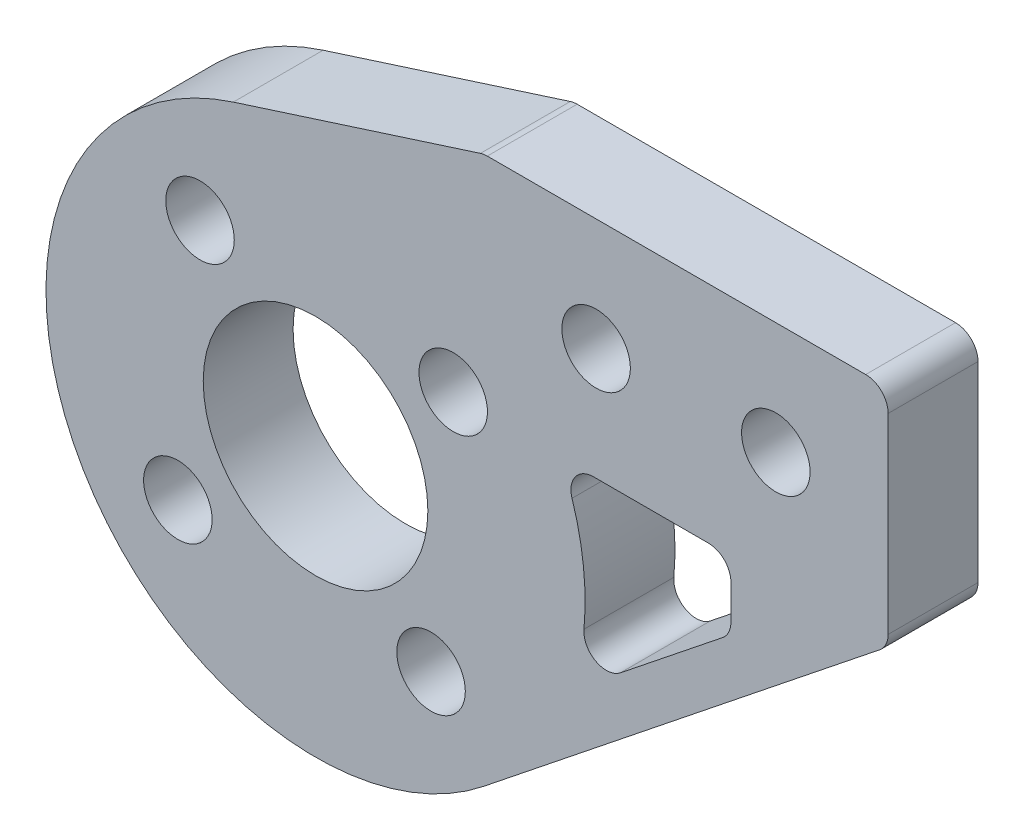
ISO-10303-21;
HEADER;
FILE_DESCRIPTION(('STEP AP214'),'2;1');
FILE_NAME('part.step','',(''),(''),'','','');
FILE_SCHEMA(('AUTOMOTIVE_DESIGN { 1 0 10303 214 1 1 1 1 }'));
ENDSEC;
DATA;
#1=APPLICATION_CONTEXT('core data for automotive mechanical design processes');
#2=APPLICATION_PROTOCOL_DEFINITION('international standard','automotive_design',2000,#1);
#3=PRODUCT_CONTEXT('',#1,'mechanical');
#4=PRODUCT('Part','Part','',(#3));
#5=PRODUCT_RELATED_PRODUCT_CATEGORY('part','',(#4));
#6=PRODUCT_DEFINITION_FORMATION('','',#4);
#7=PRODUCT_DEFINITION_CONTEXT('part definition',#1,'design');
#8=PRODUCT_DEFINITION('design','',#6,#7);
#9=PRODUCT_DEFINITION_SHAPE('','',#8);
#10=(LENGTH_UNIT() NAMED_UNIT(*) SI_UNIT(.MILLI.,.METRE.));
#11=(NAMED_UNIT(*) PLANE_ANGLE_UNIT() SI_UNIT($,.RADIAN.));
#12=(NAMED_UNIT(*) SI_UNIT($,.STERADIAN.) SOLID_ANGLE_UNIT());
#13=UNCERTAINTY_MEASURE_WITH_UNIT(LENGTH_MEASURE(1.E-05),#10,'distance_accuracy_value','');
#14=(GEOMETRIC_REPRESENTATION_CONTEXT(3) GLOBAL_UNCERTAINTY_ASSIGNED_CONTEXT((#13)) GLOBAL_UNIT_ASSIGNED_CONTEXT((#10,
#11,#12)) REPRESENTATION_CONTEXT('',''));
#15=CARTESIAN_POINT('',(0.,0.,0.));
#16=DIRECTION('',(0.,0.,1.));
#17=DIRECTION('',(1.,0.,0.));
#18=AXIS2_PLACEMENT_3D('',#15,#16,#17);
#19=CARTESIAN_POINT('',(0.,0.,4.));
#20=DIRECTION('',(0.,0.,1.));
#21=DIRECTION('',(1.,0.,0.));
#22=AXIS2_PLACEMENT_3D('',#19,#20,#21);
#23=PLANE('',#22);
#24=CARTESIAN_POINT('',(-6.12835554495183,-5.14230087749231,4.));
#25=DIRECTION('',(0.,0.,1.));
#26=DIRECTION('',(1.,0.,0.));
#27=AXIS2_PLACEMENT_3D('',#24,#25,#26);
#28=CIRCLE('',#27,1.525);
#29=CARTESIAN_POINT('',(-4.60335554495183,-5.14230087749231,4.));
#30=VERTEX_POINT('',#29);
#31=EDGE_CURVE('E284',#30,#30,#28,.T.);
#32=ORIENTED_EDGE('',*,*,#31,.F.);
#33=EDGE_LOOP('',(#32));
#34=FACE_BOUND('',#33,.T.);
#35=CARTESIAN_POINT('',(5.1423008774923,-6.12835554495183,4.));
#36=DIRECTION('',(0.,0.,1.));
#37=DIRECTION('',(1.,0.,0.));
#38=AXIS2_PLACEMENT_3D('',#35,#36,#37);
#39=CIRCLE('',#38,1.525);
#40=CARTESIAN_POINT('',(6.66730087749231,-6.12835554495183,4.));
#41=VERTEX_POINT('',#40);
#42=EDGE_CURVE('E287',#41,#41,#39,.T.);
#43=ORIENTED_EDGE('',*,*,#42,.F.);
#44=EDGE_LOOP('',(#43));
#45=FACE_BOUND('',#44,.T.);
#46=CARTESIAN_POINT('',(6.12835554495183,5.1423008774923,4.));
#47=DIRECTION('',(0.,0.,1.));
#48=DIRECTION('',(1.,0.,0.));
#49=AXIS2_PLACEMENT_3D('',#46,#47,#48);
#50=CIRCLE('',#49,1.525);
#51=CARTESIAN_POINT('',(7.65335554495184,5.1423008774923,4.));
#52=VERTEX_POINT('',#51);
#53=EDGE_CURVE('E291',#52,#52,#50,.T.);
#54=ORIENTED_EDGE('',*,*,#53,.F.);
#55=EDGE_LOOP('',(#54));
#56=FACE_BOUND('',#55,.T.);
#57=CARTESIAN_POINT('',(0.,0.,4.));
#58=DIRECTION('',(0.,0.,1.));
#59=DIRECTION('',(1.,0.,0.));
#60=AXIS2_PLACEMENT_3D('',#57,#58,#59);
#61=CIRCLE('',#60,5.);
#62=CARTESIAN_POINT('',(5.,0.,4.));
#63=VERTEX_POINT('',#62);
#64=EDGE_CURVE('E294',#63,#63,#61,.T.);
#65=ORIENTED_EDGE('',*,*,#64,.F.);
#66=EDGE_LOOP('',(#65));
#67=FACE_BOUND('',#66,.T.);
#68=CARTESIAN_POINT('',(-5.1423008774923,6.12835554495183,4.));
#69=DIRECTION('',(0.,0.,1.));
#70=DIRECTION('',(1.,0.,0.));
#71=AXIS2_PLACEMENT_3D('',#68,#69,#70);
#72=CIRCLE('',#71,1.525);
#73=CARTESIAN_POINT('',(-3.6173008774923,6.12835554495183,4.));
#74=VERTEX_POINT('',#73);
#75=EDGE_CURVE('E172',#74,#74,#72,.T.);
#76=ORIENTED_EDGE('',*,*,#75,.F.);
#77=EDGE_LOOP('',(#76));
#78=FACE_BOUND('',#77,.T.);
#79=DIRECTION('',(-0.781387389104163,-0.624046270839735,0.));
#80=VECTOR('',#79,1.);
#81=CARTESIAN_POINT('',(7.48855525007682,-9.37664866924995,4.));
#82=LINE('',#81,#80);
#83=CARTESIAN_POINT('',(25.1140422676365,4.6997487725522,4.));
#84=VERTEX_POINT('',#83);
#85=CARTESIAN_POINT('',(7.48855525007682,-9.37664866924995,4.));
#86=VERTEX_POINT('',#85);
#87=EDGE_CURVE('E153',#84,#86,#82,.T.);
#88=ORIENTED_EDGE('',*,*,#87,.F.);
#89=CARTESIAN_POINT('',(24.4899959967968,5.48113616165636,4.));
#90=DIRECTION('',(0.,0.,1.));
#91=DIRECTION('',(1.,0.,0.));
#92=AXIS2_PLACEMENT_3D('',#89,#90,#91);
#93=CIRCLE('',#92,1.);
#94=CARTESIAN_POINT('',(25.4899959967968,5.48113616165636,4.));
#95=VERTEX_POINT('',#94);
#96=EDGE_CURVE('E218',#84,#95,#93,.T.);
#97=ORIENTED_EDGE('',*,*,#96,.T.);
#98=DIRECTION('',(0.,-1.,0.));
#99=VECTOR('',#98,1.);
#100=CARTESIAN_POINT('',(25.4899959967968,0.,4.));
#101=LINE('',#100,#99);
#102=CARTESIAN_POINT('',(25.4899959967968,14.,4.));
#103=VERTEX_POINT('',#102);
#104=EDGE_CURVE('E163',#103,#95,#101,.T.);
#105=ORIENTED_EDGE('',*,*,#104,.F.);
#106=CARTESIAN_POINT('',(24.4899959967968,14.,4.));
#107=DIRECTION('',(0.,0.,1.));
#108=DIRECTION('',(1.,0.,0.));
#109=AXIS2_PLACEMENT_3D('',#106,#107,#108);
#110=CIRCLE('',#109,1.);
#111=CARTESIAN_POINT('',(24.4899959967968,15.,4.));
#112=VERTEX_POINT('',#111);
#113=EDGE_CURVE('E216',#103,#112,#110,.T.);
#114=ORIENTED_EDGE('',*,*,#113,.T.);
#115=DIRECTION('',(-1.,0.,0.));
#116=VECTOR('',#115,1.);
#117=CARTESIAN_POINT('',(0.,15.,4.));
#118=LINE('',#117,#116);
#119=CARTESIAN_POINT('',(7.64625439059058,15.,4.));
#120=VERTEX_POINT('',#119);
#121=EDGE_CURVE('E301',#112,#120,#118,.T.);
#122=ORIENTED_EDGE('',*,*,#121,.T.);
#123=CARTESIAN_POINT('',(7.64625439059058,14.,4.));
#124=DIRECTION('',(0.,0.,1.));
#125=DIRECTION('',(1.,0.,0.));
#126=AXIS2_PLACEMENT_3D('',#123,#124,#125);
#127=CIRCLE('',#126,1.);
#128=CARTESIAN_POINT('',(7.34118635336405,14.9523305585052,4.));
#129=VERTEX_POINT('',#128);
#130=EDGE_CURVE('E54',#120,#129,#127,.T.);
#131=ORIENTED_EDGE('',*,*,#130,.T.);
#132=DIRECTION('',(-0.95233055850516,-0.305068037226535,0.));
#133=VECTOR('',#132,1.);
#134=CARTESIAN_POINT('',(-3.66081644671842,11.4279667020619,4.));
#135=LINE('',#134,#133);
#136=CARTESIAN_POINT('',(-3.66081644671842,11.4279667020619,4.));
#137=VERTEX_POINT('',#136);
#138=EDGE_CURVE('E168',#129,#137,#135,.T.);
#139=ORIENTED_EDGE('',*,*,#138,.T.);
#140=CARTESIAN_POINT('',(0.,0.,4.));
#141=DIRECTION('',(0.,0.,1.));
#142=DIRECTION('',(1.,0.,0.));
#143=AXIS2_PLACEMENT_3D('',#140,#141,#142);
#144=CIRCLE('',#143,12.);
#145=EDGE_CURVE('E164',#137,#86,#144,.T.);
#146=ORIENTED_EDGE('',*,*,#145,.T.);
#147=EDGE_LOOP('',(#88,#97,#105,#114,#122,#131,#139,#146));
#148=FACE_BOUND('',#147,.T.);
#149=CARTESIAN_POINT('',(20.4899959967968,10.,4.));
#150=DIRECTION('',(0.,0.,1.));
#151=DIRECTION('',(1.,0.,0.));
#152=AXIS2_PLACEMENT_3D('',#149,#150,#151);
#153=CIRCLE('',#152,1.525);
#154=CARTESIAN_POINT('',(22.0149959967968,10.,4.));
#155=VERTEX_POINT('',#154);
#156=EDGE_CURVE('E304',#155,#155,#153,.T.);
#157=ORIENTED_EDGE('',*,*,#156,.F.);
#158=EDGE_LOOP('',(#157));
#159=FACE_BOUND('',#158,.T.);
#160=CARTESIAN_POINT('',(12.4899959967968,10.,4.));
#161=DIRECTION('',(0.,0.,1.));
#162=DIRECTION('',(1.,0.,0.));
#163=AXIS2_PLACEMENT_3D('',#160,#161,#162);
#164=CIRCLE('',#163,1.525);
#165=CARTESIAN_POINT('',(14.0149959967968,10.,4.));
#166=VERTEX_POINT('',#165);
#167=EDGE_CURVE('E182',#166,#166,#164,.T.);
#168=ORIENTED_EDGE('',*,*,#167,.F.);
#169=EDGE_LOOP('',(#168));
#170=FACE_BOUND('',#169,.T.);
#171=DIRECTION('',(0.781387389104163,0.624046270839735,0.));
#172=VECTOR('',#171,1.);
#173=CARTESIAN_POINT('',(6.24046270839735,-7.81387389104163,4.));
#174=LINE('',#173,#172);
#175=CARTESIAN_POINT('',(13.5705261571603,-1.95980096383015,4.));
#176=VERTEX_POINT('',#175);
#177=CARTESIAN_POINT('',(18.1140422676365,1.66882719779611,4.));
#178=VERTEX_POINT('',#177);
#179=EDGE_CURVE('E254',#176,#178,#174,.T.);
#180=ORIENTED_EDGE('',*,*,#179,.F.);
#181=CARTESIAN_POINT('',(12.9464798863205,-1.17841357472599,4.));
#182=DIRECTION('',(0.,0.,1.));
#183=DIRECTION('',(1.,0.,0.));
#184=AXIS2_PLACEMENT_3D('',#181,#182,#183);
#185=CIRCLE('',#184,1.);
#186=CARTESIAN_POINT('',(11.950596818142,-1.08776637667015,4.));
#187=VERTEX_POINT('',#186);
#188=EDGE_CURVE('E235',#176,#187,#185,.F.);
#189=ORIENTED_EDGE('',*,*,#188,.T.);
#190=CARTESIAN_POINT('',(0.,0.,4.));
#191=DIRECTION('',(0.,0.,1.));
#192=DIRECTION('',(1.,0.,0.));
#193=AXIS2_PLACEMENT_3D('',#190,#191,#192);
#194=CIRCLE('',#193,12.);
#195=CARTESIAN_POINT('',(11.4178309632489,3.69230769230769,4.));
#196=VERTEX_POINT('',#195);
#197=EDGE_CURVE('E277',#187,#196,#194,.T.);
#198=ORIENTED_EDGE('',*,*,#197,.T.);
#199=CARTESIAN_POINT('',(12.369316876853,4.,4.));
#200=DIRECTION('',(0.,0.,1.));
#201=DIRECTION('',(1.,0.,0.));
#202=AXIS2_PLACEMENT_3D('',#199,#200,#201);
#203=CIRCLE('',#202,1.);
#204=CARTESIAN_POINT('',(12.369316876853,5.,4.));
#205=VERTEX_POINT('',#204);
#206=EDGE_CURVE('E227',#196,#205,#203,.F.);
#207=ORIENTED_EDGE('',*,*,#206,.T.);
#208=DIRECTION('',(-1.,0.,0.));
#209=VECTOR('',#208,1.);
#210=CARTESIAN_POINT('',(0.,5.,4.));
#211=LINE('',#210,#209);
#212=CARTESIAN_POINT('',(17.4899959967968,5.,4.));
#213=VERTEX_POINT('',#212);
#214=EDGE_CURVE('E245',#213,#205,#211,.T.);
#215=ORIENTED_EDGE('',*,*,#214,.F.);
#216=CARTESIAN_POINT('',(17.4899959967968,4.,4.));
#217=DIRECTION('',(0.,0.,1.));
#218=DIRECTION('',(1.,0.,0.));
#219=AXIS2_PLACEMENT_3D('',#216,#217,#218);
#220=CIRCLE('',#219,1.);
#221=CARTESIAN_POINT('',(18.4899959967968,4.,4.));
#222=VERTEX_POINT('',#221);
#223=EDGE_CURVE('E47',#213,#222,#220,.F.);
#224=ORIENTED_EDGE('',*,*,#223,.T.);
#225=DIRECTION('',(0.,1.,0.));
#226=VECTOR('',#225,1.);
#227=CARTESIAN_POINT('',(18.4899959967968,0.,4.));
#228=LINE('',#227,#226);
#229=CARTESIAN_POINT('',(18.4899959967968,2.45021458690027,4.));
#230=VERTEX_POINT('',#229);
#231=EDGE_CURVE('E243',#230,#222,#228,.T.);
#232=ORIENTED_EDGE('',*,*,#231,.F.);
#233=CARTESIAN_POINT('',(17.4899959967968,2.45021458690027,4.));
#234=DIRECTION('',(0.,0.,1.));
#235=DIRECTION('',(1.,0.,0.));
#236=AXIS2_PLACEMENT_3D('',#233,#234,#235);
#237=CIRCLE('',#236,1.);
#238=EDGE_CURVE('E231',#230,#178,#237,.F.);
#239=ORIENTED_EDGE('',*,*,#238,.T.);
#240=EDGE_LOOP('',(#180,#189,#198,#207,#215,#224,#232,#239));
#241=FACE_BOUND('',#240,.T.);
#242=ADVANCED_FACE('F39',(#34,#45,#56,#67,#78,#148,#159,#170,#241),#23,.T.);
#243=CARTESIAN_POINT('',(0.,0.,0.));
#244=DIRECTION('',(0.,0.,1.));
#245=DIRECTION('',(1.,0.,0.));
#246=AXIS2_PLACEMENT_3D('',#243,#244,#245);
#247=PLANE('',#246);
#248=CARTESIAN_POINT('',(12.4899959967968,10.,0.));
#249=DIRECTION('',(0.,0.,1.));
#250=DIRECTION('',(1.,0.,0.));
#251=AXIS2_PLACEMENT_3D('',#248,#249,#250);
#252=CIRCLE('',#251,1.525);
#253=CARTESIAN_POINT('',(14.0149959967968,10.,0.));
#254=VERTEX_POINT('',#253);
#255=EDGE_CURVE('E288',#254,#254,#252,.T.);
#256=ORIENTED_EDGE('',*,*,#255,.T.);
#257=EDGE_LOOP('',(#256));
#258=FACE_BOUND('',#257,.T.);
#259=CARTESIAN_POINT('',(20.4899959967968,10.,0.));
#260=DIRECTION('',(0.,0.,1.));
#261=DIRECTION('',(1.,0.,0.));
#262=AXIS2_PLACEMENT_3D('',#259,#260,#261);
#263=CIRCLE('',#262,1.525);
#264=CARTESIAN_POINT('',(22.0149959967968,10.,0.));
#265=VERTEX_POINT('',#264);
#266=EDGE_CURVE('E330',#265,#265,#263,.T.);
#267=ORIENTED_EDGE('',*,*,#266,.T.);
#268=EDGE_LOOP('',(#267));
#269=FACE_BOUND('',#268,.T.);
#270=DIRECTION('',(0.,-1.,0.));
#271=VECTOR('',#270,1.);
#272=CARTESIAN_POINT('',(25.4899959967968,0.,0.));
#273=LINE('',#272,#271);
#274=CARTESIAN_POINT('',(25.4899959967968,14.,0.));
#275=VERTEX_POINT('',#274);
#276=CARTESIAN_POINT('',(25.4899959967968,5.48113616165636,0.));
#277=VERTEX_POINT('',#276);
#278=EDGE_CURVE('E323',#275,#277,#273,.T.);
#279=ORIENTED_EDGE('',*,*,#278,.T.);
#280=CARTESIAN_POINT('',(24.4899959967968,5.48113616165636,0.));
#281=DIRECTION('',(0.,0.,1.));
#282=DIRECTION('',(1.,0.,0.));
#283=AXIS2_PLACEMENT_3D('',#280,#281,#282);
#284=CIRCLE('',#283,1.);
#285=CARTESIAN_POINT('',(25.1140422676365,4.6997487725522,0.));
#286=VERTEX_POINT('',#285);
#287=EDGE_CURVE('E212',#277,#286,#284,.F.);
#288=ORIENTED_EDGE('',*,*,#287,.T.);
#289=DIRECTION('',(-0.781387389104163,-0.624046270839735,0.));
#290=VECTOR('',#289,1.);
#291=CARTESIAN_POINT('',(7.48855525007682,-9.37664866924995,0.));
#292=LINE('',#291,#290);
#293=CARTESIAN_POINT('',(7.48855525007682,-9.37664866924995,0.));
#294=VERTEX_POINT('',#293);
#295=EDGE_CURVE('E321',#286,#294,#292,.T.);
#296=ORIENTED_EDGE('',*,*,#295,.T.);
#297=CARTESIAN_POINT('',(0.,0.,0.));
#298=DIRECTION('',(0.,0.,1.));
#299=DIRECTION('',(1.,0.,0.));
#300=AXIS2_PLACEMENT_3D('',#297,#298,#299);
#301=CIRCLE('',#300,12.);
#302=CARTESIAN_POINT('',(-3.66081644671842,11.4279667020619,0.));
#303=VERTEX_POINT('',#302);
#304=EDGE_CURVE('E176',#303,#294,#301,.T.);
#305=ORIENTED_EDGE('',*,*,#304,.F.);
#306=DIRECTION('',(-0.95233055850516,-0.305068037226535,0.));
#307=VECTOR('',#306,1.);
#308=CARTESIAN_POINT('',(-3.66081644671842,11.4279667020619,0.));
#309=LINE('',#308,#307);
#310=CARTESIAN_POINT('',(7.34118635336405,14.9523305585052,0.));
#311=VERTEX_POINT('',#310);
#312=EDGE_CURVE('E328',#311,#303,#309,.T.);
#313=ORIENTED_EDGE('',*,*,#312,.F.);
#314=CARTESIAN_POINT('',(7.64625439059058,14.,0.));
#315=DIRECTION('',(0.,0.,1.));
#316=DIRECTION('',(1.,0.,0.));
#317=AXIS2_PLACEMENT_3D('',#314,#315,#316);
#318=CIRCLE('',#317,1.);
#319=CARTESIAN_POINT('',(7.64625439059058,15.,0.));
#320=VERTEX_POINT('',#319);
#321=EDGE_CURVE('E208',#311,#320,#318,.F.);
#322=ORIENTED_EDGE('',*,*,#321,.T.);
#323=DIRECTION('',(-1.,0.,0.));
#324=VECTOR('',#323,1.);
#325=CARTESIAN_POINT('',(0.,15.,0.));
#326=LINE('',#325,#324);
#327=CARTESIAN_POINT('',(24.4899959967968,15.,0.));
#328=VERTEX_POINT('',#327);
#329=EDGE_CURVE('E326',#328,#320,#326,.T.);
#330=ORIENTED_EDGE('',*,*,#329,.F.);
#331=CARTESIAN_POINT('',(24.4899959967968,14.,0.));
#332=DIRECTION('',(0.,0.,1.));
#333=DIRECTION('',(1.,0.,0.));
#334=AXIS2_PLACEMENT_3D('',#331,#332,#333);
#335=CIRCLE('',#334,1.);
#336=EDGE_CURVE('E210',#328,#275,#335,.F.);
#337=ORIENTED_EDGE('',*,*,#336,.T.);
#338=EDGE_LOOP('',(#279,#288,#296,#305,#313,#322,#330,#337));
#339=FACE_BOUND('',#338,.T.);
#340=CARTESIAN_POINT('',(-5.1423008774923,6.12835554495183,0.));
#341=DIRECTION('',(0.,0.,1.));
#342=DIRECTION('',(1.,0.,0.));
#343=AXIS2_PLACEMENT_3D('',#340,#341,#342);
#344=CIRCLE('',#343,1.525);
#345=CARTESIAN_POINT('',(-3.6173008774923,6.12835554495183,0.));
#346=VERTEX_POINT('',#345);
#347=EDGE_CURVE('E317',#346,#346,#344,.T.);
#348=ORIENTED_EDGE('',*,*,#347,.T.);
#349=EDGE_LOOP('',(#348));
#350=FACE_BOUND('',#349,.T.);
#351=CARTESIAN_POINT('',(0.,0.,0.));
#352=DIRECTION('',(0.,0.,1.));
#353=DIRECTION('',(1.,0.,0.));
#354=AXIS2_PLACEMENT_3D('',#351,#352,#353);
#355=CIRCLE('',#354,5.);
#356=CARTESIAN_POINT('',(5.,0.,0.));
#357=VERTEX_POINT('',#356);
#358=EDGE_CURVE('E314',#357,#357,#355,.T.);
#359=ORIENTED_EDGE('',*,*,#358,.T.);
#360=EDGE_LOOP('',(#359));
#361=FACE_BOUND('',#360,.T.);
#362=CARTESIAN_POINT('',(6.12835554495183,5.1423008774923,0.));
#363=DIRECTION('',(0.,0.,1.));
#364=DIRECTION('',(1.,0.,0.));
#365=AXIS2_PLACEMENT_3D('',#362,#363,#364);
#366=CIRCLE('',#365,1.525);
#367=CARTESIAN_POINT('',(7.65335554495184,5.1423008774923,0.));
#368=VERTEX_POINT('',#367);
#369=EDGE_CURVE('E311',#368,#368,#366,.T.);
#370=ORIENTED_EDGE('',*,*,#369,.T.);
#371=EDGE_LOOP('',(#370));
#372=FACE_BOUND('',#371,.T.);
#373=CARTESIAN_POINT('',(5.1423008774923,-6.12835554495183,0.));
#374=DIRECTION('',(0.,0.,1.));
#375=DIRECTION('',(1.,0.,0.));
#376=AXIS2_PLACEMENT_3D('',#373,#374,#375);
#377=CIRCLE('',#376,1.525);
#378=CARTESIAN_POINT('',(6.66730087749231,-6.12835554495183,0.));
#379=VERTEX_POINT('',#378);
#380=EDGE_CURVE('E271',#379,#379,#377,.T.);
#381=ORIENTED_EDGE('',*,*,#380,.T.);
#382=EDGE_LOOP('',(#381));
#383=FACE_BOUND('',#382,.T.);
#384=CARTESIAN_POINT('',(-6.12835554495183,-5.14230087749231,0.));
#385=DIRECTION('',(0.,0.,1.));
#386=DIRECTION('',(1.,0.,0.));
#387=AXIS2_PLACEMENT_3D('',#384,#385,#386);
#388=CIRCLE('',#387,1.525);
#389=CARTESIAN_POINT('',(-4.60335554495183,-5.14230087749231,0.));
#390=VERTEX_POINT('',#389);
#391=EDGE_CURVE('E268',#390,#390,#388,.T.);
#392=ORIENTED_EDGE('',*,*,#391,.T.);
#393=EDGE_LOOP('',(#392));
#394=FACE_BOUND('',#393,.T.);
#395=CARTESIAN_POINT('',(0.,0.,0.));
#396=DIRECTION('',(0.,0.,1.));
#397=DIRECTION('',(1.,0.,0.));
#398=AXIS2_PLACEMENT_3D('',#395,#396,#397);
#399=CIRCLE('',#398,12.);
#400=CARTESIAN_POINT('',(11.950596818142,-1.08776637667015,0.));
#401=VERTEX_POINT('',#400);
#402=CARTESIAN_POINT('',(11.4178309632489,3.69230769230769,0.));
#403=VERTEX_POINT('',#402);
#404=EDGE_CURVE('E283',#401,#403,#399,.T.);
#405=ORIENTED_EDGE('',*,*,#404,.F.);
#406=CARTESIAN_POINT('',(12.9464798863205,-1.17841357472599,0.));
#407=DIRECTION('',(0.,0.,1.));
#408=DIRECTION('',(1.,0.,0.));
#409=AXIS2_PLACEMENT_3D('',#406,#407,#408);
#410=CIRCLE('',#409,1.);
#411=CARTESIAN_POINT('',(13.5705261571603,-1.95980096383015,0.));
#412=VERTEX_POINT('',#411);
#413=EDGE_CURVE('E237',#401,#412,#410,.T.);
#414=ORIENTED_EDGE('',*,*,#413,.T.);
#415=DIRECTION('',(0.781387389104163,0.624046270839735,0.));
#416=VECTOR('',#415,1.);
#417=CARTESIAN_POINT('',(6.24046270839735,-7.81387389104163,0.));
#418=LINE('',#417,#416);
#419=CARTESIAN_POINT('',(18.1140422676365,1.66882719779611,0.));
#420=VERTEX_POINT('',#419);
#421=EDGE_CURVE('E273',#412,#420,#418,.T.);
#422=ORIENTED_EDGE('',*,*,#421,.T.);
#423=CARTESIAN_POINT('',(17.4899959967968,2.45021458690027,0.));
#424=DIRECTION('',(0.,0.,1.));
#425=DIRECTION('',(1.,0.,0.));
#426=AXIS2_PLACEMENT_3D('',#423,#424,#425);
#427=CIRCLE('',#426,1.);
#428=CARTESIAN_POINT('',(18.4899959967968,2.45021458690027,0.));
#429=VERTEX_POINT('',#428);
#430=EDGE_CURVE('E233',#420,#429,#427,.T.);
#431=ORIENTED_EDGE('',*,*,#430,.T.);
#432=DIRECTION('',(0.,1.,0.));
#433=VECTOR('',#432,1.);
#434=CARTESIAN_POINT('',(18.4899959967968,0.,0.));
#435=LINE('',#434,#433);
#436=CARTESIAN_POINT('',(18.4899959967968,4.,0.));
#437=VERTEX_POINT('',#436);
#438=EDGE_CURVE('E264',#429,#437,#435,.T.);
#439=ORIENTED_EDGE('',*,*,#438,.T.);
#440=CARTESIAN_POINT('',(17.4899959967968,4.,0.));
#441=DIRECTION('',(0.,0.,1.));
#442=DIRECTION('',(1.,0.,0.));
#443=AXIS2_PLACEMENT_3D('',#440,#441,#442);
#444=CIRCLE('',#443,1.);
#445=CARTESIAN_POINT('',(17.4899959967968,5.,0.));
#446=VERTEX_POINT('',#445);
#447=EDGE_CURVE('E11',#437,#446,#444,.T.);
#448=ORIENTED_EDGE('',*,*,#447,.T.);
#449=DIRECTION('',(-1.,0.,0.));
#450=VECTOR('',#449,1.);
#451=CARTESIAN_POINT('',(0.,5.,0.));
#452=LINE('',#451,#450);
#453=CARTESIAN_POINT('',(12.369316876853,5.,0.));
#454=VERTEX_POINT('',#453);
#455=EDGE_CURVE('E262',#446,#454,#452,.T.);
#456=ORIENTED_EDGE('',*,*,#455,.T.);
#457=CARTESIAN_POINT('',(12.369316876853,4.,0.));
#458=DIRECTION('',(0.,0.,1.));
#459=DIRECTION('',(1.,0.,0.));
#460=AXIS2_PLACEMENT_3D('',#457,#458,#459);
#461=CIRCLE('',#460,1.);
#462=EDGE_CURVE('E229',#454,#403,#461,.T.);
#463=ORIENTED_EDGE('',*,*,#462,.T.);
#464=EDGE_LOOP('',(#405,#414,#422,#431,#439,#448,#456,#463));
#465=FACE_BOUND('',#464,.T.);
#466=ADVANCED_FACE('F261',(#258,#269,#339,#350,#361,#372,#383,#394,#465),#247,.F.);
#467=CARTESIAN_POINT('',(0.,0.,4.));
#468=DIRECTION('',(0.,0.,-1.));
#469=DIRECTION('',(-1.,0.,0.));
#470=AXIS2_PLACEMENT_3D('',#467,#468,#469);
#471=CYLINDRICAL_SURFACE('',#470,12.);
#472=ORIENTED_EDGE('',*,*,#304,.T.);
#473=DIRECTION('',(0.,0.,-1.));
#474=VECTOR('',#473,1.);
#475=CARTESIAN_POINT('',(7.48855525007682,-9.37664866924995,4.));
#476=LINE('',#475,#474);
#477=EDGE_CURVE('E158',#86,#294,#476,.T.);
#478=ORIENTED_EDGE('',*,*,#477,.F.);
#479=ORIENTED_EDGE('',*,*,#145,.F.);
#480=DIRECTION('',(0.,0.,-1.));
#481=VECTOR('',#480,1.);
#482=CARTESIAN_POINT('',(-3.66081644671842,11.4279667020619,4.));
#483=LINE('',#482,#481);
#484=EDGE_CURVE('E178',#137,#303,#483,.T.);
#485=ORIENTED_EDGE('',*,*,#484,.T.);
#486=EDGE_LOOP('',(#472,#478,#479,#485));
#487=FACE_BOUND('',#486,.T.);
#488=ADVANCED_FACE('F174',(#487),#471,.T.);
#489=CARTESIAN_POINT('',(7.48855525007682,-9.37664866924995,4.));
#490=DIRECTION('',(0.624046270839735,-0.781387389104163,0.));
#491=DIRECTION('',(0.781387389104163,0.624046270839735,0.));
#492=AXIS2_PLACEMENT_3D('',#489,#490,#491);
#493=PLANE('',#492);
#494=ORIENTED_EDGE('',*,*,#295,.F.);
#495=DIRECTION('',(0.,0.,-1.));
#496=VECTOR('',#495,1.);
#497=CARTESIAN_POINT('',(25.1140422676365,4.6997487725522,4.));
#498=LINE('',#497,#496);
#499=EDGE_CURVE('E161',#286,#84,#498,.F.);
#500=ORIENTED_EDGE('',*,*,#499,.T.);
#501=ORIENTED_EDGE('',*,*,#87,.T.);
#502=ORIENTED_EDGE('',*,*,#477,.T.);
#503=EDGE_LOOP('',(#494,#500,#501,#502));
#504=FACE_BOUND('',#503,.T.);
#505=ADVANCED_FACE('F156',(#504),#493,.T.);
#506=CARTESIAN_POINT('',(25.4899959967968,0.,4.));
#507=DIRECTION('',(1.,0.,0.));
#508=DIRECTION('',(0.,0.,-1.));
#509=AXIS2_PLACEMENT_3D('',#506,#507,#508);
#510=PLANE('',#509);
#511=ORIENTED_EDGE('',*,*,#104,.T.);
#512=DIRECTION('',(0.,0.,-1.));
#513=VECTOR('',#512,1.);
#514=CARTESIAN_POINT('',(25.4899959967968,5.48113616165636,4.));
#515=LINE('',#514,#513);
#516=EDGE_CURVE('E205',#95,#277,#515,.T.);
#517=ORIENTED_EDGE('',*,*,#516,.T.);
#518=ORIENTED_EDGE('',*,*,#278,.F.);
#519=DIRECTION('',(0.,0.,-1.));
#520=VECTOR('',#519,1.);
#521=CARTESIAN_POINT('',(25.4899959967968,14.,4.));
#522=LINE('',#521,#520);
#523=EDGE_CURVE('E203',#275,#103,#522,.F.);
#524=ORIENTED_EDGE('',*,*,#523,.T.);
#525=EDGE_LOOP('',(#511,#517,#518,#524));
#526=FACE_BOUND('',#525,.T.);
#527=ADVANCED_FACE('F484',(#526),#510,.T.);
#528=CARTESIAN_POINT('',(0.,15.,4.));
#529=DIRECTION('',(0.,-1.,0.));
#530=DIRECTION('',(1.,0.,0.));
#531=AXIS2_PLACEMENT_3D('',#528,#529,#530);
#532=PLANE('',#531);
#533=ORIENTED_EDGE('',*,*,#121,.F.);
#534=DIRECTION('',(0.,0.,-1.));
#535=VECTOR('',#534,1.);
#536=CARTESIAN_POINT('',(24.4899959967968,15.,0.));
#537=LINE('',#536,#535);
#538=EDGE_CURVE('E221',#112,#328,#537,.T.);
#539=ORIENTED_EDGE('',*,*,#538,.T.);
#540=ORIENTED_EDGE('',*,*,#329,.T.);
#541=DIRECTION('',(0.,0.,-1.));
#542=VECTOR('',#541,1.);
#543=CARTESIAN_POINT('',(7.64625439059058,15.,4.));
#544=LINE('',#543,#542);
#545=EDGE_CURVE('E62',#320,#120,#544,.F.);
#546=ORIENTED_EDGE('',*,*,#545,.T.);
#547=EDGE_LOOP('',(#533,#539,#540,#546));
#548=FACE_BOUND('',#547,.T.);
#549=ADVANCED_FACE('F494',(#548),#532,.F.);
#550=CARTESIAN_POINT('',(20.4899959967968,10.,4.));
#551=DIRECTION('',(0.,0.,-1.));
#552=DIRECTION('',(-1.,0.,0.));
#553=AXIS2_PLACEMENT_3D('',#550,#551,#552);
#554=CYLINDRICAL_SURFACE('',#553,1.525);
#555=ORIENTED_EDGE('',*,*,#156,.T.);
#556=EDGE_LOOP('',(#555));
#557=FACE_BOUND('',#556,.T.);
#558=ORIENTED_EDGE('',*,*,#266,.F.);
#559=EDGE_LOOP('',(#558));
#560=FACE_BOUND('',#559,.T.);
#561=ADVANCED_FACE('F503',(#557,#560),#554,.F.);
#562=CARTESIAN_POINT('',(-3.66081644671842,11.4279667020619,4.));
#563=DIRECTION('',(0.305068037226535,-0.95233055850516,0.));
#564=DIRECTION('',(0.95233055850516,0.305068037226535,0.));
#565=AXIS2_PLACEMENT_3D('',#562,#563,#564);
#566=PLANE('',#565);
#567=ORIENTED_EDGE('',*,*,#138,.F.);
#568=DIRECTION('',(0.,0.,-1.));
#569=VECTOR('',#568,1.);
#570=CARTESIAN_POINT('',(7.34118635336405,14.9523305585052,4.));
#571=LINE('',#570,#569);
#572=EDGE_CURVE('E224',#129,#311,#571,.T.);
#573=ORIENTED_EDGE('',*,*,#572,.T.);
#574=ORIENTED_EDGE('',*,*,#312,.T.);
#575=ORIENTED_EDGE('',*,*,#484,.F.);
#576=EDGE_LOOP('',(#567,#573,#574,#575));
#577=FACE_BOUND('',#576,.T.);
#578=ADVANCED_FACE('F510',(#577),#566,.F.);
#579=CARTESIAN_POINT('',(-5.1423008774923,6.12835554495183,4.));
#580=DIRECTION('',(0.,0.,-1.));
#581=DIRECTION('',(-1.,0.,0.));
#582=AXIS2_PLACEMENT_3D('',#579,#580,#581);
#583=CYLINDRICAL_SURFACE('',#582,1.525);
#584=ORIENTED_EDGE('',*,*,#75,.T.);
#585=EDGE_LOOP('',(#584));
#586=FACE_BOUND('',#585,.T.);
#587=ORIENTED_EDGE('',*,*,#347,.F.);
#588=EDGE_LOOP('',(#587));
#589=FACE_BOUND('',#588,.T.);
#590=ADVANCED_FACE('F514',(#586,#589),#583,.F.);
#591=CARTESIAN_POINT('',(0.,0.,4.));
#592=DIRECTION('',(0.,0.,-1.));
#593=DIRECTION('',(-1.,0.,0.));
#594=AXIS2_PLACEMENT_3D('',#591,#592,#593);
#595=CYLINDRICAL_SURFACE('',#594,5.);
#596=ORIENTED_EDGE('',*,*,#64,.T.);
#597=EDGE_LOOP('',(#596));
#598=FACE_BOUND('',#597,.T.);
#599=ORIENTED_EDGE('',*,*,#358,.F.);
#600=EDGE_LOOP('',(#599));
#601=FACE_BOUND('',#600,.T.);
#602=ADVANCED_FACE('F527',(#598,#601),#595,.F.);
#603=CARTESIAN_POINT('',(6.12835554495183,5.1423008774923,4.));
#604=DIRECTION('',(0.,0.,-1.));
#605=DIRECTION('',(-1.,0.,0.));
#606=AXIS2_PLACEMENT_3D('',#603,#604,#605);
#607=CYLINDRICAL_SURFACE('',#606,1.525);
#608=ORIENTED_EDGE('',*,*,#53,.T.);
#609=EDGE_LOOP('',(#608));
#610=FACE_BOUND('',#609,.T.);
#611=ORIENTED_EDGE('',*,*,#369,.F.);
#612=EDGE_LOOP('',(#611));
#613=FACE_BOUND('',#612,.T.);
#614=ADVANCED_FACE('F534',(#610,#613),#607,.F.);
#615=CARTESIAN_POINT('',(5.1423008774923,-6.12835554495183,4.));
#616=DIRECTION('',(0.,0.,-1.));
#617=DIRECTION('',(-1.,0.,0.));
#618=AXIS2_PLACEMENT_3D('',#615,#616,#617);
#619=CYLINDRICAL_SURFACE('',#618,1.525);
#620=ORIENTED_EDGE('',*,*,#42,.T.);
#621=EDGE_LOOP('',(#620));
#622=FACE_BOUND('',#621,.T.);
#623=ORIENTED_EDGE('',*,*,#380,.F.);
#624=EDGE_LOOP('',(#623));
#625=FACE_BOUND('',#624,.T.);
#626=ADVANCED_FACE('F349',(#622,#625),#619,.F.);
#627=CARTESIAN_POINT('',(-6.12835554495183,-5.14230087749231,4.));
#628=DIRECTION('',(0.,0.,-1.));
#629=DIRECTION('',(-1.,0.,0.));
#630=AXIS2_PLACEMENT_3D('',#627,#628,#629);
#631=CYLINDRICAL_SURFACE('',#630,1.525);
#632=ORIENTED_EDGE('',*,*,#31,.T.);
#633=EDGE_LOOP('',(#632));
#634=FACE_BOUND('',#633,.T.);
#635=ORIENTED_EDGE('',*,*,#391,.F.);
#636=EDGE_LOOP('',(#635));
#637=FACE_BOUND('',#636,.T.);
#638=ADVANCED_FACE('F340',(#634,#637),#631,.F.);
#639=CARTESIAN_POINT('',(12.4899959967968,10.,4.));
#640=DIRECTION('',(0.,0.,-1.));
#641=DIRECTION('',(-1.,0.,0.));
#642=AXIS2_PLACEMENT_3D('',#639,#640,#641);
#643=CYLINDRICAL_SURFACE('',#642,1.525);
#644=ORIENTED_EDGE('',*,*,#167,.T.);
#645=EDGE_LOOP('',(#644));
#646=FACE_BOUND('',#645,.T.);
#647=ORIENTED_EDGE('',*,*,#255,.F.);
#648=EDGE_LOOP('',(#647));
#649=FACE_BOUND('',#648,.T.);
#650=ADVANCED_FACE('F337',(#646,#649),#643,.F.);
#651=CARTESIAN_POINT('',(0.,0.,0.));
#652=DIRECTION('',(0.,0.,1.));
#653=DIRECTION('',(1.,0.,0.));
#654=AXIS2_PLACEMENT_3D('',#651,#652,#653);
#655=CYLINDRICAL_SURFACE('',#654,12.);
#656=ORIENTED_EDGE('',*,*,#404,.T.);
#657=DIRECTION('',(0.,0.,1.));
#658=VECTOR('',#657,1.);
#659=CARTESIAN_POINT('',(11.4178309632489,3.69230769230769,0.));
#660=LINE('',#659,#658);
#661=EDGE_CURVE('E180',#403,#196,#660,.T.);
#662=ORIENTED_EDGE('',*,*,#661,.T.);
#663=ORIENTED_EDGE('',*,*,#197,.F.);
#664=DIRECTION('',(0.,0.,1.));
#665=VECTOR('',#664,1.);
#666=CARTESIAN_POINT('',(11.950596818142,-1.08776637667015,0.));
#667=LINE('',#666,#665);
#668=EDGE_CURVE('E177',#187,#401,#667,.F.);
#669=ORIENTED_EDGE('',*,*,#668,.T.);
#670=EDGE_LOOP('',(#656,#662,#663,#669));
#671=FACE_BOUND('',#670,.T.);
#672=ADVANCED_FACE('F339',(#671),#655,.T.);
#673=CARTESIAN_POINT('',(0.,5.,0.));
#674=DIRECTION('',(0.,1.,0.));
#675=DIRECTION('',(-1.,0.,0.));
#676=AXIS2_PLACEMENT_3D('',#673,#674,#675);
#677=PLANE('',#676);
#678=ORIENTED_EDGE('',*,*,#214,.T.);
#679=DIRECTION('',(0.,0.,1.));
#680=VECTOR('',#679,1.);
#681=CARTESIAN_POINT('',(12.369316876853,5.,0.));
#682=LINE('',#681,#680);
#683=EDGE_CURVE('E191',#205,#454,#682,.F.);
#684=ORIENTED_EDGE('',*,*,#683,.T.);
#685=ORIENTED_EDGE('',*,*,#455,.F.);
#686=DIRECTION('',(0.,0.,1.));
#687=VECTOR('',#686,1.);
#688=CARTESIAN_POINT('',(17.4899959967968,5.,4.));
#689=LINE('',#688,#687);
#690=EDGE_CURVE('E188',#446,#213,#689,.T.);
#691=ORIENTED_EDGE('',*,*,#690,.T.);
#692=EDGE_LOOP('',(#678,#684,#685,#691));
#693=FACE_BOUND('',#692,.T.);
#694=ADVANCED_FACE('F266',(#693),#677,.F.);
#695=CARTESIAN_POINT('',(18.4899959967968,0.,0.));
#696=DIRECTION('',(1.,0.,0.));
#697=DIRECTION('',(0.,0.,-1.));
#698=AXIS2_PLACEMENT_3D('',#695,#696,#697);
#699=PLANE('',#698);
#700=ORIENTED_EDGE('',*,*,#438,.F.);
#701=DIRECTION('',(0.,0.,1.));
#702=VECTOR('',#701,1.);
#703=CARTESIAN_POINT('',(18.4899959967968,2.45021458690027,4.));
#704=LINE('',#703,#702);
#705=EDGE_CURVE('E195',#429,#230,#704,.T.);
#706=ORIENTED_EDGE('',*,*,#705,.T.);
#707=ORIENTED_EDGE('',*,*,#231,.T.);
#708=DIRECTION('',(0.,0.,1.));
#709=VECTOR('',#708,1.);
#710=CARTESIAN_POINT('',(18.4899959967968,4.,0.));
#711=LINE('',#710,#709);
#712=EDGE_CURVE('E193',#222,#437,#711,.F.);
#713=ORIENTED_EDGE('',*,*,#712,.T.);
#714=EDGE_LOOP('',(#700,#706,#707,#713));
#715=FACE_BOUND('',#714,.T.);
#716=ADVANCED_FACE('F251',(#715),#699,.F.);
#717=CARTESIAN_POINT('',(6.24046270839735,-7.81387389104163,0.));
#718=DIRECTION('',(0.624046270839735,-0.781387389104162,0.));
#719=DIRECTION('',(0.781387389104162,0.624046270839735,0.));
#720=AXIS2_PLACEMENT_3D('',#717,#718,#719);
#721=PLANE('',#720);
#722=ORIENTED_EDGE('',*,*,#179,.T.);
#723=DIRECTION('',(0.,0.,1.));
#724=VECTOR('',#723,1.);
#725=CARTESIAN_POINT('',(18.1140422676365,1.66882719779611,0.));
#726=LINE('',#725,#724);
#727=EDGE_CURVE('E201',#178,#420,#726,.F.);
#728=ORIENTED_EDGE('',*,*,#727,.T.);
#729=ORIENTED_EDGE('',*,*,#421,.F.);
#730=DIRECTION('',(0.,0.,1.));
#731=VECTOR('',#730,1.);
#732=CARTESIAN_POINT('',(13.5705261571602,-1.95980096383016,0.));
#733=LINE('',#732,#731);
#734=EDGE_CURVE('E198',#412,#176,#733,.T.);
#735=ORIENTED_EDGE('',*,*,#734,.T.);
#736=EDGE_LOOP('',(#722,#728,#729,#735));
#737=FACE_BOUND('',#736,.T.);
#738=ADVANCED_FACE('F363',(#737),#721,.F.);
#739=CARTESIAN_POINT('',(12.369316876853,4.,0.));
#740=DIRECTION('',(0.,0.,1.));
#741=DIRECTION('',(1.,0.,0.));
#742=AXIS2_PLACEMENT_3D('',#739,#740,#741);
#743=CYLINDRICAL_SURFACE('',#742,1.);
#744=ORIENTED_EDGE('',*,*,#462,.F.);
#745=ORIENTED_EDGE('',*,*,#683,.F.);
#746=ORIENTED_EDGE('',*,*,#206,.F.);
#747=ORIENTED_EDGE('',*,*,#661,.F.);
#748=EDGE_LOOP('',(#744,#745,#746,#747));
#749=FACE_BOUND('',#748,.T.);
#750=ADVANCED_FACE('F366',(#749),#743,.F.);
#751=CARTESIAN_POINT('',(17.4899959967968,2.45021458690027,0.));
#752=DIRECTION('',(0.,0.,-1.));
#753=DIRECTION('',(-1.,0.,0.));
#754=AXIS2_PLACEMENT_3D('',#751,#752,#753);
#755=CYLINDRICAL_SURFACE('',#754,1.);
#756=ORIENTED_EDGE('',*,*,#430,.F.);
#757=ORIENTED_EDGE('',*,*,#727,.F.);
#758=ORIENTED_EDGE('',*,*,#238,.F.);
#759=ORIENTED_EDGE('',*,*,#705,.F.);
#760=EDGE_LOOP('',(#756,#757,#758,#759));
#761=FACE_BOUND('',#760,.T.);
#762=ADVANCED_FACE('F389',(#761),#755,.F.);
#763=CARTESIAN_POINT('',(12.9464798863205,-1.17841357472599,0.));
#764=DIRECTION('',(0.,0.,1.));
#765=DIRECTION('',(1.,0.,0.));
#766=AXIS2_PLACEMENT_3D('',#763,#764,#765);
#767=CYLINDRICAL_SURFACE('',#766,1.);
#768=ORIENTED_EDGE('',*,*,#413,.F.);
#769=ORIENTED_EDGE('',*,*,#668,.F.);
#770=ORIENTED_EDGE('',*,*,#188,.F.);
#771=ORIENTED_EDGE('',*,*,#734,.F.);
#772=EDGE_LOOP('',(#768,#769,#770,#771));
#773=FACE_BOUND('',#772,.T.);
#774=ADVANCED_FACE('F397',(#773),#767,.F.);
#775=CARTESIAN_POINT('',(24.4899959967968,5.48113616165636,4.));
#776=DIRECTION('',(0.,0.,-1.));
#777=DIRECTION('',(-1.,0.,0.));
#778=AXIS2_PLACEMENT_3D('',#775,#776,#777);
#779=CYLINDRICAL_SURFACE('',#778,1.);
#780=ORIENTED_EDGE('',*,*,#96,.F.);
#781=ORIENTED_EDGE('',*,*,#499,.F.);
#782=ORIENTED_EDGE('',*,*,#287,.F.);
#783=ORIENTED_EDGE('',*,*,#516,.F.);
#784=EDGE_LOOP('',(#780,#781,#782,#783));
#785=FACE_BOUND('',#784,.T.);
#786=ADVANCED_FACE('F405',(#785),#779,.T.);
#787=CARTESIAN_POINT('',(24.4899959967968,14.,4.));
#788=DIRECTION('',(0.,0.,1.));
#789=DIRECTION('',(1.,0.,0.));
#790=AXIS2_PLACEMENT_3D('',#787,#788,#789);
#791=CYLINDRICAL_SURFACE('',#790,1.);
#792=ORIENTED_EDGE('',*,*,#113,.F.);
#793=ORIENTED_EDGE('',*,*,#523,.F.);
#794=ORIENTED_EDGE('',*,*,#336,.F.);
#795=ORIENTED_EDGE('',*,*,#538,.F.);
#796=EDGE_LOOP('',(#792,#793,#794,#795));
#797=FACE_BOUND('',#796,.T.);
#798=ADVANCED_FACE('F413',(#797),#791,.T.);
#799=CARTESIAN_POINT('',(7.64625439059058,14.,4.));
#800=DIRECTION('',(0.,0.,-1.));
#801=DIRECTION('',(-1.,0.,0.));
#802=AXIS2_PLACEMENT_3D('',#799,#800,#801);
#803=CYLINDRICAL_SURFACE('',#802,1.);
#804=ORIENTED_EDGE('',*,*,#130,.F.);
#805=ORIENTED_EDGE('',*,*,#545,.F.);
#806=ORIENTED_EDGE('',*,*,#321,.F.);
#807=ORIENTED_EDGE('',*,*,#572,.F.);
#808=EDGE_LOOP('',(#804,#805,#806,#807));
#809=FACE_BOUND('',#808,.T.);
#810=ADVANCED_FACE('F421',(#809),#803,.T.);
#811=CARTESIAN_POINT('',(17.4899959967968,4.,0.));
#812=DIRECTION('',(0.,0.,-1.));
#813=DIRECTION('',(-1.,0.,0.));
#814=AXIS2_PLACEMENT_3D('',#811,#812,#813);
#815=CYLINDRICAL_SURFACE('',#814,1.);
#816=ORIENTED_EDGE('',*,*,#447,.F.);
#817=ORIENTED_EDGE('',*,*,#712,.F.);
#818=ORIENTED_EDGE('',*,*,#223,.F.);
#819=ORIENTED_EDGE('',*,*,#690,.F.);
#820=EDGE_LOOP('',(#816,#817,#818,#819));
#821=FACE_BOUND('',#820,.T.);
#822=ADVANCED_FACE('F41',(#821),#815,.F.);
#823=CLOSED_SHELL('',(#242,#466,#488,#505,#527,#549,#561,#578,#590,#602,#614,#626,#638,#650,
#672,#694,#716,#738,#750,#762,#774,#786,#798,#810,#822));
#824=MANIFOLD_SOLID_BREP('B2',#823);
#825=ADVANCED_BREP_SHAPE_REPRESENTATION('',(#18,#824),#14);
#826=SHAPE_DEFINITION_REPRESENTATION(#9,#825);
ENDSEC;
END-ISO-10303-21;
